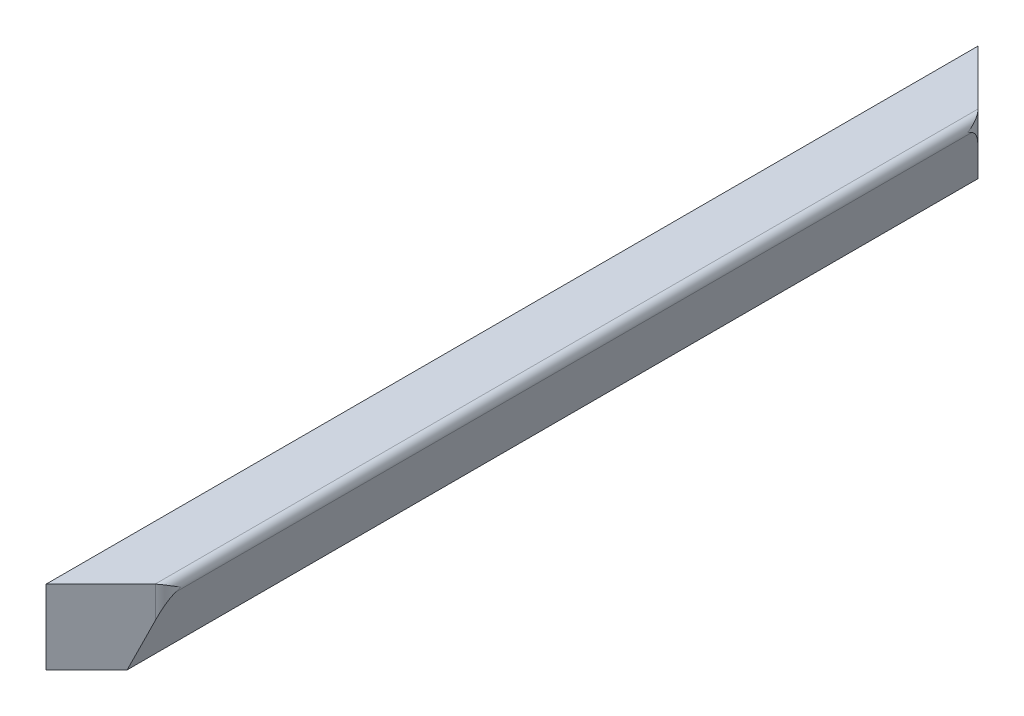
ISO-10303-21;
HEADER;
FILE_DESCRIPTION(('STEP AP214'),'2;1');
FILE_NAME('part.step','',(''),(''),'','','');
FILE_SCHEMA(('AUTOMOTIVE_DESIGN { 1 0 10303 214 1 1 1 1 }'));
ENDSEC;
DATA;
#1=APPLICATION_CONTEXT('core data for automotive mechanical design processes');
#2=APPLICATION_PROTOCOL_DEFINITION('international standard','automotive_design',2000,#1);
#3=PRODUCT_CONTEXT('',#1,'mechanical');
#4=PRODUCT('Part','Part','',(#3));
#5=PRODUCT_RELATED_PRODUCT_CATEGORY('part','',(#4));
#6=PRODUCT_DEFINITION_FORMATION('','',#4);
#7=PRODUCT_DEFINITION_CONTEXT('part definition',#1,'design');
#8=PRODUCT_DEFINITION('design','',#6,#7);
#9=PRODUCT_DEFINITION_SHAPE('','',#8);
#10=(LENGTH_UNIT() NAMED_UNIT(*) SI_UNIT(.MILLI.,.METRE.));
#11=(NAMED_UNIT(*) PLANE_ANGLE_UNIT() SI_UNIT($,.RADIAN.));
#12=(NAMED_UNIT(*) SI_UNIT($,.STERADIAN.) SOLID_ANGLE_UNIT());
#13=UNCERTAINTY_MEASURE_WITH_UNIT(LENGTH_MEASURE(1.E-05),#10,'distance_accuracy_value','');
#14=(GEOMETRIC_REPRESENTATION_CONTEXT(3) GLOBAL_UNCERTAINTY_ASSIGNED_CONTEXT((#13)) GLOBAL_UNIT_ASSIGNED_CONTEXT((#10,
#11,#12)) REPRESENTATION_CONTEXT('',''));
#15=CARTESIAN_POINT('',(0.,0.,0.));
#16=DIRECTION('',(0.,0.,1.));
#17=DIRECTION('',(1.,0.,0.));
#18=AXIS2_PLACEMENT_3D('',#15,#16,#17);
#19=CARTESIAN_POINT('',(-23.35,2.07,-36.76416917));
#20=DIRECTION('',(0.,-1.,0.));
#21=DIRECTION('',(0.,0.,-1.));
#22=AXIS2_PLACEMENT_3D('',#19,#20,#21);
#23=PLANE('',#22);
#24=DIRECTION('',(0.707106781186549,0.,0.707106781186546));
#25=VECTOR('',#24,1.);
#26=CARTESIAN_POINT('',(-24.95,2.07,-36.76416917));
#27=LINE('',#26,#25);
#28=CARTESIAN_POINT('',(-24.95,2.07,-36.76416917));
#29=VERTEX_POINT('',#28);
#30=CARTESIAN_POINT('',(-23.35,2.07,-35.16416917));
#31=VERTEX_POINT('',#30);
#32=EDGE_CURVE('E54',#29,#31,#27,.T.);
#33=ORIENTED_EDGE('',*,*,#32,.T.);
#34=DIRECTION('',(0.,0.,1.));
#35=VECTOR('',#34,1.);
#36=CARTESIAN_POINT('',(-23.35,2.07,-36.76416917));
#37=LINE('',#36,#35);
#38=CARTESIAN_POINT('',(-23.35,2.07,-1.6));
#39=VERTEX_POINT('',#38);
#40=EDGE_CURVE('E106',#31,#39,#37,.T.);
#41=ORIENTED_EDGE('',*,*,#40,.T.);
#42=DIRECTION('',(-0.707106781186549,0.,0.707106781186546));
#43=VECTOR('',#42,1.);
#44=CARTESIAN_POINT('',(-22.7928932188135,2.07,-2.15710678118652));
#45=LINE('',#44,#43);
#46=CARTESIAN_POINT('',(-24.95,2.07,0.));
#47=VERTEX_POINT('',#46);
#48=EDGE_CURVE('E174',#39,#47,#45,.T.);
#49=ORIENTED_EDGE('',*,*,#48,.T.);
#50=DIRECTION('',(0.,0.,1.));
#51=VECTOR('',#50,1.);
#52=CARTESIAN_POINT('',(-24.95,2.07,-36.76416917));
#53=LINE('',#52,#51);
#54=EDGE_CURVE('E123',#29,#47,#53,.T.);
#55=ORIENTED_EDGE('',*,*,#54,.F.);
#56=EDGE_LOOP('',(#33,#41,#49,#55));
#57=FACE_BOUND('',#56,.T.);
#58=ADVANCED_FACE('F39',(#57),#23,.T.);
#59=CARTESIAN_POINT('',(-24.95,2.07,-36.76416917));
#60=DIRECTION('',(-1.,0.,0.));
#61=DIRECTION('',(0.,0.,1.));
#62=AXIS2_PLACEMENT_3D('',#59,#60,#61);
#63=PLANE('',#62);
#64=DIRECTION('',(0.,-1.,0.));
#65=VECTOR('',#64,1.);
#66=CARTESIAN_POINT('',(-24.95,2.07,0.));
#67=LINE('',#66,#65);
#68=CARTESIAN_POINT('',(-24.95,5.,0.));
#69=VERTEX_POINT('',#68);
#70=EDGE_CURVE('E107',#69,#47,#67,.T.);
#71=ORIENTED_EDGE('',*,*,#70,.F.);
#72=DIRECTION('',(0.,0.,1.));
#73=VECTOR('',#72,1.);
#74=CARTESIAN_POINT('',(-24.95,5.,-36.76416917));
#75=LINE('',#74,#73);
#76=CARTESIAN_POINT('',(-24.95,5.,-36.76416917));
#77=VERTEX_POINT('',#76);
#78=EDGE_CURVE('E114',#77,#69,#75,.T.);
#79=ORIENTED_EDGE('',*,*,#78,.F.);
#80=DIRECTION('',(0.,-1.,0.));
#81=VECTOR('',#80,1.);
#82=CARTESIAN_POINT('',(-24.95,2.07,-36.76416917));
#83=LINE('',#82,#81);
#84=EDGE_CURVE('E97',#77,#29,#83,.T.);
#85=ORIENTED_EDGE('',*,*,#84,.T.);
#86=ORIENTED_EDGE('',*,*,#54,.T.);
#87=EDGE_LOOP('',(#71,#79,#85,#86));
#88=FACE_BOUND('',#87,.T.);
#89=ADVANCED_FACE('F121',(#88),#63,.T.);
#90=CARTESIAN_POINT('',(-24.95,5.,-36.76416917));
#91=DIRECTION('',(0.,1.,0.));
#92=DIRECTION('',(-1.,0.,0.));
#93=AXIS2_PLACEMENT_3D('',#90,#91,#92);
#94=PLANE('',#93);
#95=DIRECTION('',(0.707106781186549,0.,0.707106781186546));
#96=VECTOR('',#95,1.);
#97=CARTESIAN_POINT('',(-24.95,5.,-36.76416917));
#98=LINE('',#97,#96);
#99=CARTESIAN_POINT('',(-22.8,5.,-34.61416917));
#100=VERTEX_POINT('',#99);
#101=EDGE_CURVE('E100',#77,#100,#98,.T.);
#102=ORIENTED_EDGE('',*,*,#101,.F.);
#103=ORIENTED_EDGE('',*,*,#78,.T.);
#104=DIRECTION('',(-0.707106781186549,0.,0.707106781186546));
#105=VECTOR('',#104,1.);
#106=CARTESIAN_POINT('',(-22.7928932188135,5.,-2.15710678118653));
#107=LINE('',#106,#105);
#108=CARTESIAN_POINT('',(-22.8,5.,-2.14999999999999));
#109=VERTEX_POINT('',#108);
#110=EDGE_CURVE('E119',#109,#69,#107,.T.);
#111=ORIENTED_EDGE('',*,*,#110,.F.);
#112=DIRECTION('',(0.,0.,1.));
#113=VECTOR('',#112,1.);
#114=CARTESIAN_POINT('',(-22.8,5.,-36.76416917));
#115=LINE('',#114,#113);
#116=EDGE_CURVE('E117',#100,#109,#115,.T.);
#117=ORIENTED_EDGE('',*,*,#116,.F.);
#118=EDGE_LOOP('',(#102,#103,#111,#117));
#119=FACE_BOUND('',#118,.T.);
#120=ADVANCED_FACE('F112',(#119),#94,.T.);
#121=CARTESIAN_POINT('',(-22.8,4.7,-36.76416917));
#122=DIRECTION('',(0.,0.,1.));
#123=DIRECTION('',(1.,0.,0.));
#124=AXIS2_PLACEMENT_3D('',#121,#122,#123);
#125=CYLINDRICAL_SURFACE('',#124,0.299999999999999);
#126=CARTESIAN_POINT('',(-22.5150450348908,4.60618812516728,-34.0727668245857));
#127=CARTESIAN_POINT('',(-22.5101695599614,4.62101048681491,-34.0449582982514));
#128=CARTESIAN_POINT('',(-22.5064860231525,4.63607814327822,-34.0170652279807));
#129=CARTESIAN_POINT('',(-22.5014895568805,4.66641757567961,-33.9612800269461));
#130=CARTESIAN_POINT('',(-22.5001699603138,4.68168865478811,-33.9333881161011));
#131=CARTESIAN_POINT('',(-22.5000051351727,4.69797453788632,-33.9036535839944));
#132=CARTESIAN_POINT('',(-22.5000000078866,4.69898728199661,-33.9018045751206));
#133=CARTESIAN_POINT('',(-22.5,4.7,-33.8999556076269));
#134=B_SPLINE_CURVE_WITH_KNOTS('',3,(#126,#127,#128,#129,#130,#131,#132,#133),.UNSPECIFIED.,.F.,
.F.,(4,2,2,4),(0.,0.0956516684746651,0.191033139922388,0.197357713954885),.UNSPECIFIED.);
#135=CARTESIAN_POINT('',(-22.5,4.7,-33.8999556076269));
#136=VERTEX_POINT('',#135);
#137=CARTESIAN_POINT('',(-22.5150450348908,4.60618812516728,-34.0727668245857));
#138=VERTEX_POINT('',#137);
#139=EDGE_CURVE('E169',#136,#138,#134,.F.);
#140=ORIENTED_EDGE('',*,*,#139,.F.);
#141=CARTESIAN_POINT('',(-22.7928932188135,4.99991581095562,-34.6070623888135));
#142=CARTESIAN_POINT('',(-22.7807913347075,4.99962478896865,-34.5949635035737));
#143=CARTESIAN_POINT('',(-22.7690255735455,4.99861812831391,-34.5825735089309));
#144=CARTESIAN_POINT('',(-22.74623816342,4.99536820532771,-34.5573221220006));
#145=CARTESIAN_POINT('',(-22.7352151373508,4.99312730640332,-34.5444616743731));
#146=CARTESIAN_POINT('',(-22.7034944019143,4.98488830443155,-34.5055077223433));
#147=CARTESIAN_POINT('',(-22.6839228451336,4.97736141419511,-34.478817904667));
#148=CARTESIAN_POINT('',(-22.6389736144885,4.9549122356862,-34.4108584299454));
#149=CARTESIAN_POINT('',(-22.6155344391366,4.93817358377778,-34.3689262819394));
#150=CARTESIAN_POINT('',(-22.5752627309358,4.90063509828258,-34.2835019377337));
#151=CARTESIAN_POINT('',(-22.558469902649,4.87981193722668,-34.2400020109286));
#152=CARTESIAN_POINT('',(-22.5300027737823,4.83378886929064,-34.148195916173));
#153=CARTESIAN_POINT('',(-22.5189424624841,4.80836248619972,-34.0998161280949));
#154=CARTESIAN_POINT('',(-22.5040940766678,4.75629830451316,-34.0027756204406));
#155=CARTESIAN_POINT('',(-22.50028482102,4.7296642676891,-33.9541161368578));
#156=CARTESIAN_POINT('',(-22.5000051364548,4.70202544134675,-33.9036535453848));
#157=CARTESIAN_POINT('',(-22.5000000093673,4.70101269707997,-33.9018045362024));
#158=CARTESIAN_POINT('',(-22.5,4.7,-33.8999556076269));
#159=B_SPLINE_CURVE_WITH_KNOTS('',3,(#141,#142,#143,#144,#145,#146,#147,#148,#149,#150,#151,
#152,#153,#154,#155,#156,#157,#158),.UNSPECIFIED.,.F.,.F.,(4,2,2,2,2,2,2,2,4),(0.,
0.0512939373215519,0.102489993142393,0.203947417205965,0.355753185056053,0.508452609896267,
0.675218054656603,0.841495607180421,0.847820181213407),.UNSPECIFIED.);
#160=CARTESIAN_POINT('',(-22.7928932188135,4.99991581095562,-34.6070623888135));
#161=VERTEX_POINT('',#160);
#162=EDGE_CURVE('E218',#161,#136,#159,.T.);
#163=ORIENTED_EDGE('',*,*,#162,.F.);
#164=CARTESIAN_POINT('',(-22.8,4.7,-34.61416917));
#165=DIRECTION('',(-0.707106781186546,0.,0.707106781186549));
#166=DIRECTION('',(0.707106781186549,0.,0.707106781186546));
#167=AXIS2_PLACEMENT_3D('',#164,#165,#166);
#168=ELLIPSE('',#167,0.424264068711927,0.299999999999999);
#169=EDGE_CURVE('E156',#100,#161,#168,.F.);
#170=ORIENTED_EDGE('',*,*,#169,.F.);
#171=ORIENTED_EDGE('',*,*,#116,.T.);
#172=CARTESIAN_POINT('',(-22.8,4.7,-2.14999999999999));
#173=DIRECTION('',(-0.707106781186546,0.,-0.707106781186549));
#174=DIRECTION('',(-0.707106781186549,0.,0.707106781186546));
#175=AXIS2_PLACEMENT_3D('',#172,#173,#174);
#176=ELLIPSE('',#175,0.424264068711926,0.299999999999999);
#177=CARTESIAN_POINT('',(-22.7928932188135,4.99991581095562,-2.15710678118653));
#178=VERTEX_POINT('',#177);
#179=EDGE_CURVE('E182',#178,#109,#176,.F.);
#180=ORIENTED_EDGE('',*,*,#179,.F.);
#181=CARTESIAN_POINT('',(-22.7928932188135,4.99991581095562,-2.15710678118653));
#182=CARTESIAN_POINT('',(-22.7807913347075,4.99962478896865,-2.16920566642633));
#183=CARTESIAN_POINT('',(-22.7690255735455,4.99861812831392,-2.18159566106904));
#184=CARTESIAN_POINT('',(-22.7462381634201,4.99536820532772,-2.20684704799934));
#185=CARTESIAN_POINT('',(-22.7352151373508,4.99312730640333,-2.2197074956268));
#186=CARTESIAN_POINT('',(-22.7034944019143,4.98488830443157,-2.25866144765666));
#187=CARTESIAN_POINT('',(-22.6839228451337,4.97736141419511,-2.285351265333));
#188=CARTESIAN_POINT('',(-22.6389736144885,4.9549122356862,-2.35331074005463));
#189=CARTESIAN_POINT('',(-22.6155344391366,4.93817358377781,-2.3952428880607));
#190=CARTESIAN_POINT('',(-22.5752627309358,4.90063509828252,-2.48066723226635));
#191=CARTESIAN_POINT('',(-22.558469902649,4.8798119372265,-2.52416715907134));
#192=CARTESIAN_POINT('',(-22.5300027737823,4.83378886929082,-2.61597325382706));
#193=CARTESIAN_POINT('',(-22.5189424624841,4.80836248620041,-2.66435304190549));
#194=CARTESIAN_POINT('',(-22.5040940766678,4.75629830451248,-2.76139354955903));
#195=CARTESIAN_POINT('',(-22.50028482102,4.72966426768655,-2.8100530331408));
#196=CARTESIAN_POINT('',(-22.5000051364548,4.70202544134656,-2.86051562461513));
#197=CARTESIAN_POINT('',(-22.5000000093673,4.70101269707988,-2.86236463379756));
#198=CARTESIAN_POINT('',(-22.5,4.7,-2.86421356237308));
#199=B_SPLINE_CURVE_WITH_KNOTS('',3,(#181,#182,#183,#184,#185,#186,#187,#188,#189,#190,#191,
#192,#193,#194,#195,#196,#197,#198),.UNSPECIFIED.,.F.,.F.,(4,2,2,2,2,2,2,2,4),(0.,
0.0512939373215079,0.102489993142307,0.203947417205963,0.355753185056119,0.508452609896263,
0.675218054656577,0.841495607180423,0.847820181213409),.UNSPECIFIED.);
#200=CARTESIAN_POINT('',(-22.5,4.7,-2.86421356237309));
#201=VERTEX_POINT('',#200);
#202=EDGE_CURVE('E154',#201,#178,#199,.F.);
#203=ORIENTED_EDGE('',*,*,#202,.F.);
#204=CARTESIAN_POINT('',(-22.5150450348908,4.60618812516728,-2.69140234541428));
#205=CARTESIAN_POINT('',(-22.5101695599614,4.62101048681353,-2.71921087174929));
#206=CARTESIAN_POINT('',(-22.5064860231525,4.63607814327752,-2.74710394201965));
#207=CARTESIAN_POINT('',(-22.5014895568805,4.66641757568034,-2.80288914305353));
#208=CARTESIAN_POINT('',(-22.5001699603138,4.68168865478959,-2.83078105389804));
#209=CARTESIAN_POINT('',(-22.5000051351726,4.6979745378865,-2.86051558600547));
#210=CARTESIAN_POINT('',(-22.5000000078866,4.69898728199671,-2.86236459487931));
#211=CARTESIAN_POINT('',(-22.5,4.7,-2.86421356237308));
#212=B_SPLINE_CURVE_WITH_KNOTS('',3,(#204,#205,#206,#207,#208,#209,#210,#211),.UNSPECIFIED.,.F.,
.F.,(4,2,2,4),(0.,0.0956516684746742,0.191033139922403,0.197357713954903),.UNSPECIFIED.);
#213=CARTESIAN_POINT('',(-22.5150450348908,4.60618812516728,-2.69140234541428));
#214=VERTEX_POINT('',#213);
#215=EDGE_CURVE('E143',#214,#201,#212,.T.);
#216=ORIENTED_EDGE('',*,*,#215,.F.);
#217=DIRECTION('',(0.,0.,1.));
#218=VECTOR('',#217,1.);
#219=CARTESIAN_POINT('',(-22.5150450348908,4.60618812516728,-36.76416917));
#220=LINE('',#219,#218);
#221=EDGE_CURVE('E128',#138,#214,#220,.T.);
#222=ORIENTED_EDGE('',*,*,#221,.F.);
#223=EDGE_LOOP('',(#140,#163,#170,#171,#180,#203,#216,#222));
#224=FACE_BOUND('',#223,.T.);
#225=ADVANCED_FACE('F152',(#224),#125,.T.);
#226=CARTESIAN_POINT('',(-22.5150450348908,4.60618812516728,-36.76416917));
#227=DIRECTION('',(0.949849883697247,-0.312706249442389,0.));
#228=DIRECTION('',(0.312706249442389,0.949849883697247,0.));
#229=AXIS2_PLACEMENT_3D('',#226,#227,#228);
#230=PLANE('',#229);
#231=DIRECTION('',(-0.298454323980183,-0.906559448130714,-0.298454323980182));
#232=VECTOR('',#231,1.);
#233=CARTESIAN_POINT('',(-22.7319386082372,3.94737067017534,-34.5461077782372));
#234=LINE('',#233,#232);
#235=CARTESIAN_POINT('',(-22.7928932188135,3.76222013394544,-34.6070623888135));
#236=VERTEX_POINT('',#235);
#237=EDGE_CURVE('E162',#236,#31,#234,.T.);
#238=ORIENTED_EDGE('',*,*,#237,.F.);
#239=CARTESIAN_POINT('',(-23.5,1.61437276898476,-33.8999556076269));
#240=DIRECTION('',(0.949849883697247,-0.312706249442389,0.));
#241=DIRECTION('',(0.312706249442389,0.949849883697247,0.));
#242=AXIS2_PLACEMENT_3D('',#239,#240,#241);
#243=ELLIPSE('',#242,3.19788939870303,1.);
#244=EDGE_CURVE('E11',#138,#236,#243,.F.);
#245=ORIENTED_EDGE('',*,*,#244,.F.);
#246=ORIENTED_EDGE('',*,*,#221,.T.);
#247=CARTESIAN_POINT('',(-23.5,1.61437276898477,-2.86421356237308));
#248=DIRECTION('',(0.949849883697247,-0.312706249442389,0.));
#249=DIRECTION('',(0.312706249442389,0.949849883697247,0.));
#250=AXIS2_PLACEMENT_3D('',#247,#248,#249);
#251=ELLIPSE('',#250,3.19788939870303,1.);
#252=CARTESIAN_POINT('',(-22.7928932188135,3.76222013394555,-2.15710678118654));
#253=VERTEX_POINT('',#252);
#254=EDGE_CURVE('E48',#253,#214,#251,.F.);
#255=ORIENTED_EDGE('',*,*,#254,.F.);
#256=DIRECTION('',(0.298454323980183,0.906559448130714,-0.298454323980181));
#257=VECTOR('',#256,1.);
#258=CARTESIAN_POINT('',(-19.4571708459375,13.8945264552052,-5.49282915406248));
#259=LINE('',#258,#257);
#260=EDGE_CURVE('E179',#39,#253,#259,.T.);
#261=ORIENTED_EDGE('',*,*,#260,.F.);
#262=ORIENTED_EDGE('',*,*,#40,.F.);
#263=EDGE_LOOP('',(#238,#245,#246,#255,#261,#262));
#264=FACE_BOUND('',#263,.T.);
#265=ADVANCED_FACE('F160',(#264),#230,.T.);
#266=CARTESIAN_POINT('',(-22.7928932188135,-38.0838429602886,-2.15710678118653));
#267=DIRECTION('',(-0.707106781186546,0.,-0.707106781186549));
#268=DIRECTION('',(-0.707106781186549,0.,0.707106781186546));
#269=AXIS2_PLACEMENT_3D('',#266,#267,#268);
#270=PLANE('',#269);
#271=ORIENTED_EDGE('',*,*,#179,.T.);
#272=ORIENTED_EDGE('',*,*,#110,.T.);
#273=ORIENTED_EDGE('',*,*,#70,.T.);
#274=ORIENTED_EDGE('',*,*,#48,.F.);
#275=ORIENTED_EDGE('',*,*,#260,.T.);
#276=DIRECTION('',(0.,1.,0.));
#277=VECTOR('',#276,1.);
#278=CARTESIAN_POINT('',(-22.7928932188135,-38.0838429602886,-2.15710678118653));
#279=LINE('',#278,#277);
#280=EDGE_CURVE('E146',#253,#178,#279,.T.);
#281=ORIENTED_EDGE('',*,*,#280,.T.);
#282=EDGE_LOOP('',(#271,#272,#273,#274,#275,#281));
#283=FACE_BOUND('',#282,.T.);
#284=ADVANCED_FACE('F206',(#283),#270,.F.);
#285=CARTESIAN_POINT('',(-23.5,-38.0838429602886,-2.86421356237308));
#286=DIRECTION('',(0.,1.,0.));
#287=DIRECTION('',(-1.,0.,0.));
#288=AXIS2_PLACEMENT_3D('',#285,#286,#287);
#289=CYLINDRICAL_SURFACE('',#288,1.);
#290=ORIENTED_EDGE('',*,*,#202,.T.);
#291=ORIENTED_EDGE('',*,*,#280,.F.);
#292=ORIENTED_EDGE('',*,*,#254,.T.);
#293=ORIENTED_EDGE('',*,*,#215,.T.);
#294=EDGE_LOOP('',(#290,#291,#292,#293));
#295=FACE_BOUND('',#294,.T.);
#296=ADVANCED_FACE('F142',(#295),#289,.T.);
#297=CARTESIAN_POINT('',(-24.95,-38.0838429602886,-36.76416917));
#298=DIRECTION('',(-0.707106781186546,0.,0.707106781186549));
#299=DIRECTION('',(0.707106781186549,0.,0.707106781186546));
#300=AXIS2_PLACEMENT_3D('',#297,#298,#299);
#301=PLANE('',#300);
#302=ORIENTED_EDGE('',*,*,#169,.T.);
#303=DIRECTION('',(0.,1.,0.));
#304=VECTOR('',#303,1.);
#305=CARTESIAN_POINT('',(-22.7928932188135,-38.0838429602886,-34.6070623888135));
#306=LINE('',#305,#304);
#307=EDGE_CURVE('E167',#236,#161,#306,.T.);
#308=ORIENTED_EDGE('',*,*,#307,.F.);
#309=ORIENTED_EDGE('',*,*,#237,.T.);
#310=ORIENTED_EDGE('',*,*,#32,.F.);
#311=ORIENTED_EDGE('',*,*,#84,.F.);
#312=ORIENTED_EDGE('',*,*,#101,.T.);
#313=EDGE_LOOP('',(#302,#308,#309,#310,#311,#312));
#314=FACE_BOUND('',#313,.T.);
#315=ADVANCED_FACE('F99',(#314),#301,.F.);
#316=CARTESIAN_POINT('',(-23.5,-38.0838429602886,-33.8999556076269));
#317=DIRECTION('',(0.,1.,0.));
#318=DIRECTION('',(-1.,0.,0.));
#319=AXIS2_PLACEMENT_3D('',#316,#317,#318);
#320=CYLINDRICAL_SURFACE('',#319,1.);
#321=ORIENTED_EDGE('',*,*,#162,.T.);
#322=ORIENTED_EDGE('',*,*,#139,.T.);
#323=ORIENTED_EDGE('',*,*,#244,.T.);
#324=ORIENTED_EDGE('',*,*,#307,.T.);
#325=EDGE_LOOP('',(#321,#322,#323,#324));
#326=FACE_BOUND('',#325,.T.);
#327=ADVANCED_FACE('F166',(#326),#320,.T.);
#328=CLOSED_SHELL('',(#58,#89,#120,#225,#265,#284,#296,#315,#327));
#329=MANIFOLD_SOLID_BREP('B2',#328);
#330=ADVANCED_BREP_SHAPE_REPRESENTATION('',(#18,#329),#14);
#331=SHAPE_DEFINITION_REPRESENTATION(#9,#330);
ENDSEC;
END-ISO-10303-21;
